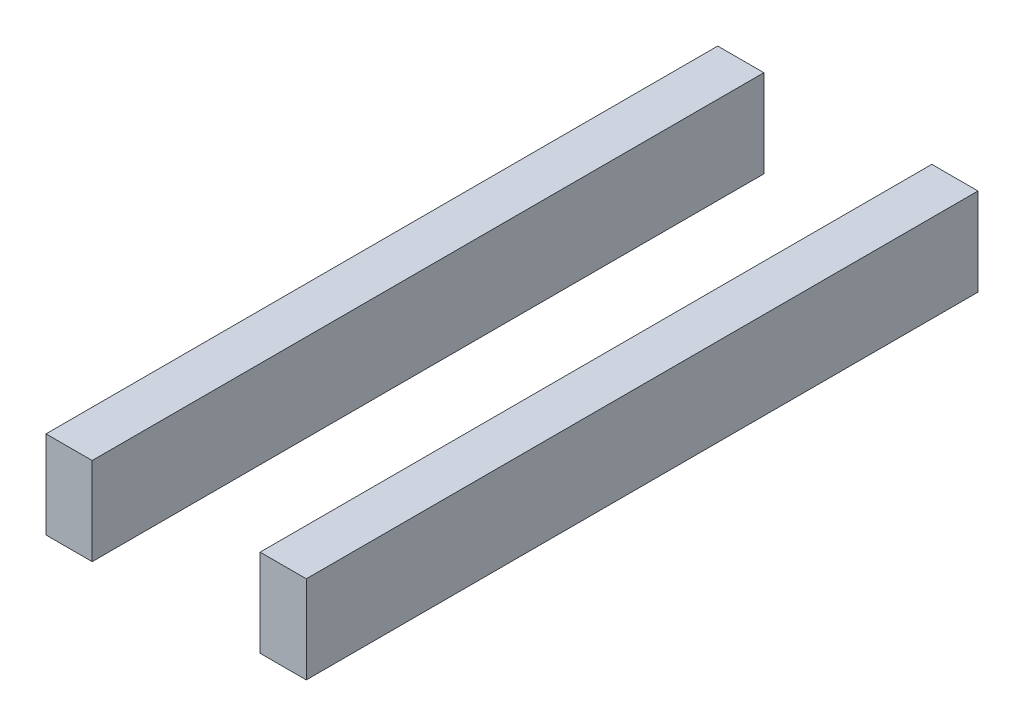
ISO-10303-21;
HEADER;
FILE_DESCRIPTION(('STEP AP214'),'2;1');
FILE_NAME('part.step','',(''),(''),'','','');
FILE_SCHEMA(('AUTOMOTIVE_DESIGN { 1 0 10303 214 1 1 1 1 }'));
ENDSEC;
DATA;
#1=APPLICATION_CONTEXT('core data for automotive mechanical design processes');
#2=APPLICATION_PROTOCOL_DEFINITION('international standard','automotive_design',2000,#1);
#3=PRODUCT_CONTEXT('',#1,'mechanical');
#4=PRODUCT('Part','Part','',(#3));
#5=PRODUCT_RELATED_PRODUCT_CATEGORY('part','',(#4));
#6=PRODUCT_DEFINITION_FORMATION('','',#4);
#7=PRODUCT_DEFINITION_CONTEXT('part definition',#1,'design');
#8=PRODUCT_DEFINITION('design','',#6,#7);
#9=PRODUCT_DEFINITION_SHAPE('','',#8);
#10=(LENGTH_UNIT() NAMED_UNIT(*) SI_UNIT(.MILLI.,.METRE.));
#11=(NAMED_UNIT(*) PLANE_ANGLE_UNIT() SI_UNIT($,.RADIAN.));
#12=(NAMED_UNIT(*) SI_UNIT($,.STERADIAN.) SOLID_ANGLE_UNIT());
#13=UNCERTAINTY_MEASURE_WITH_UNIT(LENGTH_MEASURE(1.E-05),#10,'distance_accuracy_value','');
#14=(GEOMETRIC_REPRESENTATION_CONTEXT(3) GLOBAL_UNCERTAINTY_ASSIGNED_CONTEXT((#13)) GLOBAL_UNIT_ASSIGNED_CONTEXT((#10,
#11,#12)) REPRESENTATION_CONTEXT('',''));
#15=CARTESIAN_POINT('',(0.,0.,0.));
#16=DIRECTION('',(0.,0.,1.));
#17=DIRECTION('',(1.,0.,0.));
#18=AXIS2_PLACEMENT_3D('',#15,#16,#17);
#19=CARTESIAN_POINT('',(7.66982337511263,5.99999999999999,-0.316752533042992));
#20=DIRECTION('',(-1.,0.,0.));
#21=DIRECTION('',(0.,0.,1.));
#22=AXIS2_PLACEMENT_3D('',#19,#20,#21);
#23=PLANE('',#22);
#24=DIRECTION('',(0.,0.,-1.));
#25=VECTOR('',#24,1.);
#26=CARTESIAN_POINT('',(7.66982337511263,0.,-0.316752533042992));
#27=LINE('',#26,#25);
#28=CARTESIAN_POINT('',(7.66982337511263,0.,45.6808788891105));
#29=VERTEX_POINT('',#28);
#30=CARTESIAN_POINT('',(7.66982337511263,0.,-0.316752533042992));
#31=VERTEX_POINT('',#30);
#32=EDGE_CURVE('E108',#29,#31,#27,.T.);
#33=ORIENTED_EDGE('',*,*,#32,.T.);
#34=DIRECTION('',(0.,-1.,0.));
#35=VECTOR('',#34,1.);
#36=CARTESIAN_POINT('',(7.66982337511263,5.99999999999999,-0.316752533042992));
#37=LINE('',#36,#35);
#38=CARTESIAN_POINT('',(7.66982337511263,5.99999999999999,-0.316752533042992));
#39=VERTEX_POINT('',#38);
#40=EDGE_CURVE('E12',#39,#31,#37,.T.);
#41=ORIENTED_EDGE('',*,*,#40,.F.);
#42=DIRECTION('',(0.,0.,-1.));
#43=VECTOR('',#42,1.);
#44=CARTESIAN_POINT('',(7.66982337511263,5.99999999999999,-0.316752533042992));
#45=LINE('',#44,#43);
#46=CARTESIAN_POINT('',(7.66982337511263,5.99999999999999,45.6808788891105));
#47=VERTEX_POINT('',#46);
#48=EDGE_CURVE('E96',#47,#39,#45,.T.);
#49=ORIENTED_EDGE('',*,*,#48,.F.);
#50=DIRECTION('',(0.,-1.,0.));
#51=VECTOR('',#50,1.);
#52=CARTESIAN_POINT('',(7.66982337511263,5.99999999999999,45.6808788891105));
#53=LINE('',#52,#51);
#54=EDGE_CURVE('E104',#47,#29,#53,.T.);
#55=ORIENTED_EDGE('',*,*,#54,.T.);
#56=EDGE_LOOP('',(#33,#41,#49,#55));
#57=FACE_BOUND('',#56,.T.);
#58=ADVANCED_FACE('F45',(#57),#23,.F.);
#59=CARTESIAN_POINT('',(7.66982337511263,5.99999999999999,-0.316752533042992));
#60=DIRECTION('',(0.,0.,1.));
#61=DIRECTION('',(1.,0.,0.));
#62=AXIS2_PLACEMENT_3D('',#59,#60,#61);
#63=PLANE('',#62);
#64=DIRECTION('',(-1.,0.,0.));
#65=VECTOR('',#64,1.);
#66=CARTESIAN_POINT('',(7.66982337511263,0.,-0.316752533042992));
#67=LINE('',#66,#65);
#68=CARTESIAN_POINT('',(4.50817436912793,0.,-0.316752533042992));
#69=VERTEX_POINT('',#68);
#70=EDGE_CURVE('E100',#31,#69,#67,.T.);
#71=ORIENTED_EDGE('',*,*,#70,.T.);
#72=DIRECTION('',(0.,-1.,0.));
#73=VECTOR('',#72,1.);
#74=CARTESIAN_POINT('',(4.50817436912793,5.99999999999999,-0.316752533042992));
#75=LINE('',#74,#73);
#76=CARTESIAN_POINT('',(4.50817436912793,5.99999999999999,-0.316752533042992));
#77=VERTEX_POINT('',#76);
#78=EDGE_CURVE('E53',#77,#69,#75,.T.);
#79=ORIENTED_EDGE('',*,*,#78,.F.);
#80=DIRECTION('',(-1.,0.,0.));
#81=VECTOR('',#80,1.);
#82=CARTESIAN_POINT('',(7.66982337511263,5.99999999999999,-0.316752533042992));
#83=LINE('',#82,#81);
#84=EDGE_CURVE('E91',#39,#77,#83,.T.);
#85=ORIENTED_EDGE('',*,*,#84,.F.);
#86=ORIENTED_EDGE('',*,*,#40,.T.);
#87=EDGE_LOOP('',(#71,#79,#85,#86));
#88=FACE_BOUND('',#87,.T.);
#89=ADVANCED_FACE('F99',(#88),#63,.F.);
#90=CARTESIAN_POINT('',(4.50817436912793,5.99999999999999,-0.316752533042992));
#91=DIRECTION('',(1.,0.,0.));
#92=DIRECTION('',(0.,0.,-1.));
#93=AXIS2_PLACEMENT_3D('',#90,#91,#92);
#94=PLANE('',#93);
#95=DIRECTION('',(0.,0.,1.));
#96=VECTOR('',#95,1.);
#97=CARTESIAN_POINT('',(4.50817436912793,0.,-0.316752533042992));
#98=LINE('',#97,#96);
#99=CARTESIAN_POINT('',(4.50817436912793,0.,45.6808788891105));
#100=VERTEX_POINT('',#99);
#101=EDGE_CURVE('E78',#69,#100,#98,.T.);
#102=ORIENTED_EDGE('',*,*,#101,.T.);
#103=DIRECTION('',(0.,-1.,0.));
#104=VECTOR('',#103,1.);
#105=CARTESIAN_POINT('',(4.50817436912793,5.99999999999999,45.6808788891105));
#106=LINE('',#105,#104);
#107=CARTESIAN_POINT('',(4.50817436912793,5.99999999999999,45.6808788891105));
#108=VERTEX_POINT('',#107);
#109=EDGE_CURVE('E101',#108,#100,#106,.T.);
#110=ORIENTED_EDGE('',*,*,#109,.F.);
#111=DIRECTION('',(0.,0.,1.));
#112=VECTOR('',#111,1.);
#113=CARTESIAN_POINT('',(4.50817436912793,5.99999999999999,-0.316752533042992));
#114=LINE('',#113,#112);
#115=EDGE_CURVE('E94',#77,#108,#114,.T.);
#116=ORIENTED_EDGE('',*,*,#115,.F.);
#117=ORIENTED_EDGE('',*,*,#78,.T.);
#118=EDGE_LOOP('',(#102,#110,#116,#117));
#119=FACE_BOUND('',#118,.T.);
#120=ADVANCED_FACE('F102',(#119),#94,.F.);
#121=CARTESIAN_POINT('',(7.66982337511263,5.99999999999999,45.6808788891105));
#122=DIRECTION('',(0.,0.,-1.));
#123=DIRECTION('',(-1.,0.,0.));
#124=AXIS2_PLACEMENT_3D('',#121,#122,#123);
#125=PLANE('',#124);
#126=DIRECTION('',(1.,0.,0.));
#127=VECTOR('',#126,1.);
#128=CARTESIAN_POINT('',(7.66982337511263,0.,45.6808788891105));
#129=LINE('',#128,#127);
#130=EDGE_CURVE('E84',#100,#29,#129,.T.);
#131=ORIENTED_EDGE('',*,*,#130,.T.);
#132=ORIENTED_EDGE('',*,*,#54,.F.);
#133=DIRECTION('',(1.,0.,0.));
#134=VECTOR('',#133,1.);
#135=CARTESIAN_POINT('',(7.66982337511263,5.99999999999999,45.6808788891105));
#136=LINE('',#135,#134);
#137=EDGE_CURVE('E61',#108,#47,#136,.T.);
#138=ORIENTED_EDGE('',*,*,#137,.F.);
#139=ORIENTED_EDGE('',*,*,#109,.T.);
#140=EDGE_LOOP('',(#131,#132,#138,#139));
#141=FACE_BOUND('',#140,.T.);
#142=ADVANCED_FACE('F115',(#141),#125,.F.);
#143=CARTESIAN_POINT('',(0.,5.99999999999999,0.));
#144=DIRECTION('',(0.,-1.,0.));
#145=DIRECTION('',(0.,0.,-1.));
#146=AXIS2_PLACEMENT_3D('',#143,#144,#145);
#147=PLANE('',#146);
#148=ORIENTED_EDGE('',*,*,#48,.T.);
#149=ORIENTED_EDGE('',*,*,#84,.T.);
#150=ORIENTED_EDGE('',*,*,#115,.T.);
#151=ORIENTED_EDGE('',*,*,#137,.T.);
#152=EDGE_LOOP('',(#148,#149,#150,#151));
#153=FACE_BOUND('',#152,.T.);
#154=ADVANCED_FACE('F92',(#153),#147,.F.);
#155=CARTESIAN_POINT('',(0.,0.,0.));
#156=DIRECTION('',(0.,-1.,0.));
#157=DIRECTION('',(0.,0.,-1.));
#158=AXIS2_PLACEMENT_3D('',#155,#156,#157);
#159=PLANE('',#158);
#160=ORIENTED_EDGE('',*,*,#32,.F.);
#161=ORIENTED_EDGE('',*,*,#130,.F.);
#162=ORIENTED_EDGE('',*,*,#101,.F.);
#163=ORIENTED_EDGE('',*,*,#70,.F.);
#164=EDGE_LOOP('',(#160,#161,#162,#163));
#165=FACE_BOUND('',#164,.T.);
#166=ADVANCED_FACE('F118',(#165),#159,.T.);
#167=CLOSED_SHELL('',(#58,#89,#120,#142,#154,#166));
#168=MANIFOLD_SOLID_BREP('B2',#167);
#169=CARTESIAN_POINT('',(-6.67558080580211,5.99999999999999,0.));
#170=DIRECTION('',(-1.,0.,0.));
#171=DIRECTION('',(0.,0.,1.));
#172=AXIS2_PLACEMENT_3D('',#169,#170,#171);
#173=PLANE('',#172);
#174=DIRECTION('',(0.,0.,-1.));
#175=VECTOR('',#174,1.);
#176=CARTESIAN_POINT('',(-6.67558080580211,0.,0.));
#177=LINE('',#176,#175);
#178=CARTESIAN_POINT('',(-6.67558080580211,0.,45.9976314221535));
#179=VERTEX_POINT('',#178);
#180=CARTESIAN_POINT('',(-6.67558080580211,0.,0.));
#181=VERTEX_POINT('',#180);
#182=EDGE_CURVE('E232',#179,#181,#177,.T.);
#183=ORIENTED_EDGE('',*,*,#182,.T.);
#184=DIRECTION('',(0.,-1.,0.));
#185=VECTOR('',#184,1.);
#186=CARTESIAN_POINT('',(-6.67558080580211,5.99999999999999,0.));
#187=LINE('',#186,#185);
#188=CARTESIAN_POINT('',(-6.67558080580211,5.99999999999999,0.));
#189=VERTEX_POINT('',#188);
#190=EDGE_CURVE('E43',#189,#181,#187,.T.);
#191=ORIENTED_EDGE('',*,*,#190,.F.);
#192=DIRECTION('',(0.,0.,-1.));
#193=VECTOR('',#192,1.);
#194=CARTESIAN_POINT('',(-6.67558080580211,5.99999999999999,0.));
#195=LINE('',#194,#193);
#196=CARTESIAN_POINT('',(-6.67558080580211,5.99999999999999,45.9976314221535));
#197=VERTEX_POINT('',#196);
#198=EDGE_CURVE('E220',#197,#189,#195,.T.);
#199=ORIENTED_EDGE('',*,*,#198,.F.);
#200=DIRECTION('',(0.,-1.,0.));
#201=VECTOR('',#200,1.);
#202=CARTESIAN_POINT('',(-6.67558080580211,5.99999999999999,45.9976314221535));
#203=LINE('',#202,#201);
#204=EDGE_CURVE('E228',#197,#179,#203,.T.);
#205=ORIENTED_EDGE('',*,*,#204,.T.);
#206=EDGE_LOOP('',(#183,#191,#199,#205));
#207=FACE_BOUND('',#206,.T.);
#208=ADVANCED_FACE('F169',(#207),#173,.F.);
#209=CARTESIAN_POINT('',(-6.67558080580211,5.99999999999999,0.));
#210=DIRECTION('',(0.,0.,1.));
#211=DIRECTION('',(1.,0.,0.));
#212=AXIS2_PLACEMENT_3D('',#209,#210,#211);
#213=PLANE('',#212);
#214=DIRECTION('',(-1.,0.,0.));
#215=VECTOR('',#214,1.);
#216=CARTESIAN_POINT('',(-6.67558080580211,0.,0.));
#217=LINE('',#216,#215);
#218=CARTESIAN_POINT('',(-9.83722981178681,0.,0.));
#219=VERTEX_POINT('',#218);
#220=EDGE_CURVE('E224',#181,#219,#217,.T.);
#221=ORIENTED_EDGE('',*,*,#220,.T.);
#222=DIRECTION('',(0.,-1.,0.));
#223=VECTOR('',#222,1.);
#224=CARTESIAN_POINT('',(-9.83722981178681,5.99999999999999,0.));
#225=LINE('',#224,#223);
#226=CARTESIAN_POINT('',(-9.83722981178681,5.99999999999999,0.));
#227=VERTEX_POINT('',#226);
#228=EDGE_CURVE('E177',#227,#219,#225,.T.);
#229=ORIENTED_EDGE('',*,*,#228,.F.);
#230=DIRECTION('',(-1.,0.,0.));
#231=VECTOR('',#230,1.);
#232=CARTESIAN_POINT('',(-6.67558080580211,5.99999999999999,0.));
#233=LINE('',#232,#231);
#234=EDGE_CURVE('E215',#189,#227,#233,.T.);
#235=ORIENTED_EDGE('',*,*,#234,.F.);
#236=ORIENTED_EDGE('',*,*,#190,.T.);
#237=EDGE_LOOP('',(#221,#229,#235,#236));
#238=FACE_BOUND('',#237,.T.);
#239=ADVANCED_FACE('F223',(#238),#213,.F.);
#240=CARTESIAN_POINT('',(-9.83722981178681,5.99999999999999,0.));
#241=DIRECTION('',(1.,0.,0.));
#242=DIRECTION('',(0.,0.,-1.));
#243=AXIS2_PLACEMENT_3D('',#240,#241,#242);
#244=PLANE('',#243);
#245=DIRECTION('',(0.,0.,1.));
#246=VECTOR('',#245,1.);
#247=CARTESIAN_POINT('',(-9.83722981178681,0.,0.));
#248=LINE('',#247,#246);
#249=CARTESIAN_POINT('',(-9.83722981178681,0.,45.9976314221535));
#250=VERTEX_POINT('',#249);
#251=EDGE_CURVE('E202',#219,#250,#248,.T.);
#252=ORIENTED_EDGE('',*,*,#251,.T.);
#253=DIRECTION('',(0.,-1.,0.));
#254=VECTOR('',#253,1.);
#255=CARTESIAN_POINT('',(-9.83722981178681,5.99999999999999,45.9976314221535));
#256=LINE('',#255,#254);
#257=CARTESIAN_POINT('',(-9.83722981178681,5.99999999999999,45.9976314221535));
#258=VERTEX_POINT('',#257);
#259=EDGE_CURVE('E225',#258,#250,#256,.T.);
#260=ORIENTED_EDGE('',*,*,#259,.F.);
#261=DIRECTION('',(0.,0.,1.));
#262=VECTOR('',#261,1.);
#263=CARTESIAN_POINT('',(-9.83722981178681,5.99999999999999,0.));
#264=LINE('',#263,#262);
#265=EDGE_CURVE('E218',#227,#258,#264,.T.);
#266=ORIENTED_EDGE('',*,*,#265,.F.);
#267=ORIENTED_EDGE('',*,*,#228,.T.);
#268=EDGE_LOOP('',(#252,#260,#266,#267));
#269=FACE_BOUND('',#268,.T.);
#270=ADVANCED_FACE('F226',(#269),#244,.F.);
#271=CARTESIAN_POINT('',(-6.67558080580211,5.99999999999999,45.9976314221535));
#272=DIRECTION('',(0.,0.,-1.));
#273=DIRECTION('',(-1.,0.,0.));
#274=AXIS2_PLACEMENT_3D('',#271,#272,#273);
#275=PLANE('',#274);
#276=DIRECTION('',(1.,0.,0.));
#277=VECTOR('',#276,1.);
#278=CARTESIAN_POINT('',(-6.67558080580211,0.,45.9976314221535));
#279=LINE('',#278,#277);
#280=EDGE_CURVE('E208',#250,#179,#279,.T.);
#281=ORIENTED_EDGE('',*,*,#280,.T.);
#282=ORIENTED_EDGE('',*,*,#204,.F.);
#283=DIRECTION('',(1.,0.,0.));
#284=VECTOR('',#283,1.);
#285=CARTESIAN_POINT('',(-6.67558080580211,5.99999999999999,45.9976314221535));
#286=LINE('',#285,#284);
#287=EDGE_CURVE('E185',#258,#197,#286,.T.);
#288=ORIENTED_EDGE('',*,*,#287,.F.);
#289=ORIENTED_EDGE('',*,*,#259,.T.);
#290=EDGE_LOOP('',(#281,#282,#288,#289));
#291=FACE_BOUND('',#290,.T.);
#292=ADVANCED_FACE('F239',(#291),#275,.F.);
#293=CARTESIAN_POINT('',(0.,5.99999999999999,0.));
#294=DIRECTION('',(0.,-1.,0.));
#295=DIRECTION('',(0.,0.,-1.));
#296=AXIS2_PLACEMENT_3D('',#293,#294,#295);
#297=PLANE('',#296);
#298=ORIENTED_EDGE('',*,*,#198,.T.);
#299=ORIENTED_EDGE('',*,*,#234,.T.);
#300=ORIENTED_EDGE('',*,*,#265,.T.);
#301=ORIENTED_EDGE('',*,*,#287,.T.);
#302=EDGE_LOOP('',(#298,#299,#300,#301));
#303=FACE_BOUND('',#302,.T.);
#304=ADVANCED_FACE('F216',(#303),#297,.F.);
#305=CARTESIAN_POINT('',(0.,0.,0.));
#306=DIRECTION('',(0.,-1.,0.));
#307=DIRECTION('',(0.,0.,-1.));
#308=AXIS2_PLACEMENT_3D('',#305,#306,#307);
#309=PLANE('',#308);
#310=ORIENTED_EDGE('',*,*,#182,.F.);
#311=ORIENTED_EDGE('',*,*,#280,.F.);
#312=ORIENTED_EDGE('',*,*,#251,.F.);
#313=ORIENTED_EDGE('',*,*,#220,.F.);
#314=EDGE_LOOP('',(#310,#311,#312,#313));
#315=FACE_BOUND('',#314,.T.);
#316=ADVANCED_FACE('F242',(#315),#309,.T.);
#317=CLOSED_SHELL('',(#208,#239,#270,#292,#304,#316));
#318=MANIFOLD_SOLID_BREP('B6',#317);
#319=ADVANCED_BREP_SHAPE_REPRESENTATION('',(#18,#168,#318),#14);
#320=SHAPE_DEFINITION_REPRESENTATION(#9,#319);
ENDSEC;
END-ISO-10303-21;
